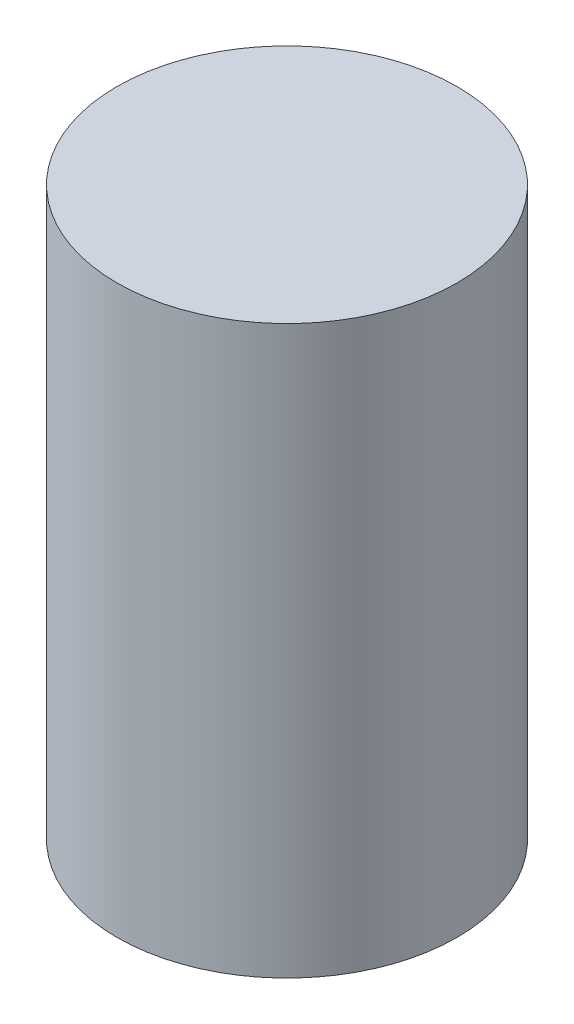
ISO-10303-21;
HEADER;
FILE_DESCRIPTION(('STEP AP214'),'2;1');
FILE_NAME('part.step','',(''),(''),'','','');
FILE_SCHEMA(('AUTOMOTIVE_DESIGN { 1 0 10303 214 1 1 1 1 }'));
ENDSEC;
DATA;
#1=APPLICATION_CONTEXT('core data for automotive mechanical design processes');
#2=APPLICATION_PROTOCOL_DEFINITION('international standard','automotive_design',2000,#1);
#3=PRODUCT_CONTEXT('',#1,'mechanical');
#4=PRODUCT('Part','Part','',(#3));
#5=PRODUCT_RELATED_PRODUCT_CATEGORY('part','',(#4));
#6=PRODUCT_DEFINITION_FORMATION('','',#4);
#7=PRODUCT_DEFINITION_CONTEXT('part definition',#1,'design');
#8=PRODUCT_DEFINITION('design','',#6,#7);
#9=PRODUCT_DEFINITION_SHAPE('','',#8);
#10=(LENGTH_UNIT() NAMED_UNIT(*) SI_UNIT(.MILLI.,.METRE.));
#11=(NAMED_UNIT(*) PLANE_ANGLE_UNIT() SI_UNIT($,.RADIAN.));
#12=(NAMED_UNIT(*) SI_UNIT($,.STERADIAN.) SOLID_ANGLE_UNIT());
#13=UNCERTAINTY_MEASURE_WITH_UNIT(LENGTH_MEASURE(1.E-05),#10,'distance_accuracy_value','');
#14=(GEOMETRIC_REPRESENTATION_CONTEXT(3) GLOBAL_UNCERTAINTY_ASSIGNED_CONTEXT((#13)) GLOBAL_UNIT_ASSIGNED_CONTEXT((#10,
#11,#12)) REPRESENTATION_CONTEXT('',''));
#15=CARTESIAN_POINT('',(0.,0.,0.));
#16=DIRECTION('',(0.,0.,1.));
#17=DIRECTION('',(1.,0.,0.));
#18=AXIS2_PLACEMENT_3D('',#15,#16,#17);
#19=CARTESIAN_POINT('',(0.,5.,0.));
#20=DIRECTION('',(0.,-1.,0.));
#21=DIRECTION('',(0.,0.,-1.));
#22=AXIS2_PLACEMENT_3D('',#19,#20,#21);
#23=CYLINDRICAL_SURFACE('',#22,1.5);
#24=CARTESIAN_POINT('',(0.,5.,0.));
#25=DIRECTION('',(0.,1.,0.));
#26=DIRECTION('',(0.,0.,1.));
#27=AXIS2_PLACEMENT_3D('',#24,#25,#26);
#28=CIRCLE('',#27,1.5);
#29=CARTESIAN_POINT('',(0.,5.,1.5));
#30=VERTEX_POINT('',#29);
#31=EDGE_CURVE('E10',#30,#30,#28,.T.);
#32=ORIENTED_EDGE('',*,*,#31,.F.);
#33=EDGE_LOOP('',(#32));
#34=FACE_BOUND('',#33,.T.);
#35=CARTESIAN_POINT('',(0.,0.,0.));
#36=DIRECTION('',(0.,1.,0.));
#37=DIRECTION('',(0.,0.,1.));
#38=AXIS2_PLACEMENT_3D('',#35,#36,#37);
#39=CIRCLE('',#38,1.5);
#40=CARTESIAN_POINT('',(0.,0.,1.5));
#41=VERTEX_POINT('',#40);
#42=EDGE_CURVE('E35',#41,#41,#39,.T.);
#43=ORIENTED_EDGE('',*,*,#42,.T.);
#44=EDGE_LOOP('',(#43));
#45=FACE_BOUND('',#44,.T.);
#46=ADVANCED_FACE('F32',(#34,#45),#23,.T.);
#47=CARTESIAN_POINT('',(0.,5.,0.));
#48=DIRECTION('',(0.,1.,0.));
#49=DIRECTION('',(0.,0.,1.));
#50=AXIS2_PLACEMENT_3D('',#47,#48,#49);
#51=PLANE('',#50);
#52=ORIENTED_EDGE('',*,*,#31,.T.);
#53=EDGE_LOOP('',(#52));
#54=FACE_BOUND('',#53,.T.);
#55=ADVANCED_FACE('F47',(#54),#51,.T.);
#56=CARTESIAN_POINT('',(0.,0.,0.));
#57=DIRECTION('',(0.,1.,0.));
#58=DIRECTION('',(0.,0.,1.));
#59=AXIS2_PLACEMENT_3D('',#56,#57,#58);
#60=PLANE('',#59);
#61=ORIENTED_EDGE('',*,*,#42,.F.);
#62=EDGE_LOOP('',(#61));
#63=FACE_BOUND('',#62,.T.);
#64=ADVANCED_FACE('F45',(#63),#60,.F.);
#65=CLOSED_SHELL('',(#46,#55,#64));
#66=MANIFOLD_SOLID_BREP('B2',#65);
#67=ADVANCED_BREP_SHAPE_REPRESENTATION('',(#18,#66),#14);
#68=SHAPE_DEFINITION_REPRESENTATION(#9,#67);
ENDSEC;
END-ISO-10303-21;
